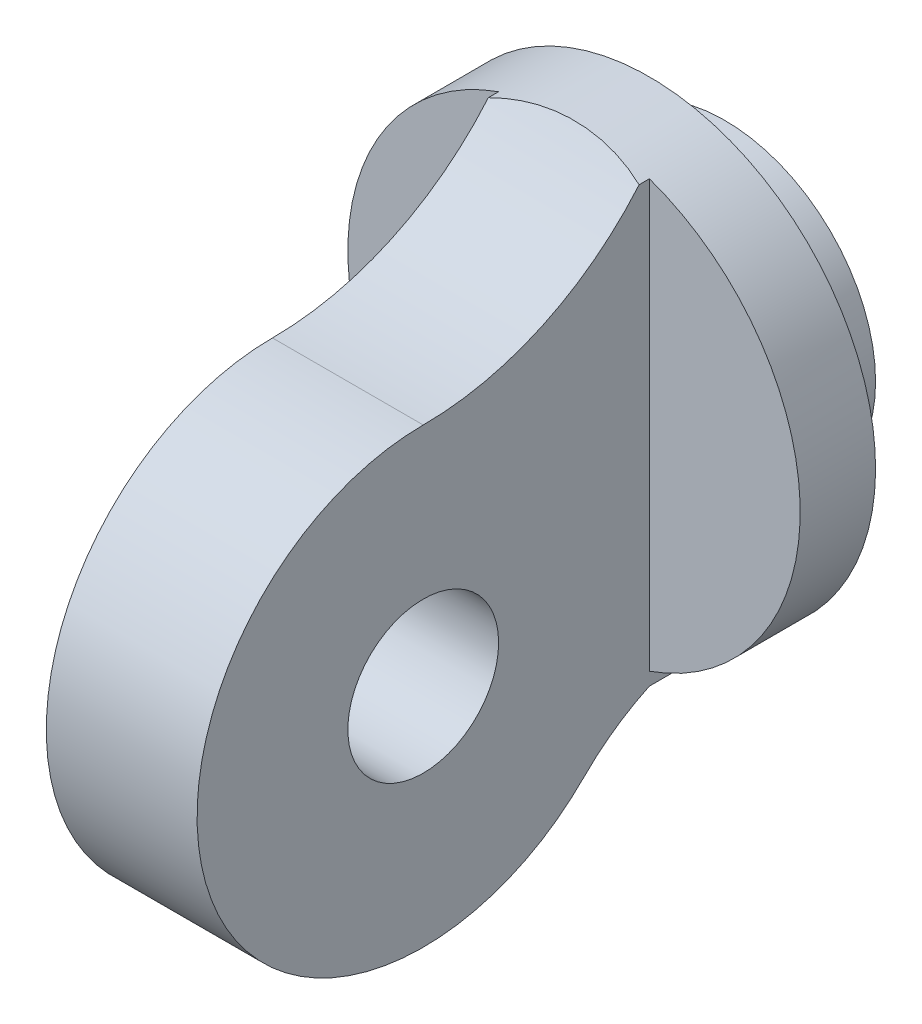
ISO-10303-21;
HEADER;
FILE_DESCRIPTION(('STEP AP214'),'2;1');
FILE_NAME('part.step','',(''),(''),'','','');
FILE_SCHEMA(('AUTOMOTIVE_DESIGN { 1 0 10303 214 1 1 1 1 }'));
ENDSEC;
DATA;
#1=APPLICATION_CONTEXT('core data for automotive mechanical design processes');
#2=APPLICATION_PROTOCOL_DEFINITION('international standard','automotive_design',2000,#1);
#3=PRODUCT_CONTEXT('',#1,'mechanical');
#4=PRODUCT('Part','Part','',(#3));
#5=PRODUCT_RELATED_PRODUCT_CATEGORY('part','',(#4));
#6=PRODUCT_DEFINITION_FORMATION('','',#4);
#7=PRODUCT_DEFINITION_CONTEXT('part definition',#1,'design');
#8=PRODUCT_DEFINITION('design','',#6,#7);
#9=PRODUCT_DEFINITION_SHAPE('','',#8);
#10=(LENGTH_UNIT() NAMED_UNIT(*) SI_UNIT(.MILLI.,.METRE.));
#11=(NAMED_UNIT(*) PLANE_ANGLE_UNIT() SI_UNIT($,.RADIAN.));
#12=(NAMED_UNIT(*) SI_UNIT($,.STERADIAN.) SOLID_ANGLE_UNIT());
#13=UNCERTAINTY_MEASURE_WITH_UNIT(LENGTH_MEASURE(1.E-05),#10,'distance_accuracy_value','');
#14=(GEOMETRIC_REPRESENTATION_CONTEXT(3) GLOBAL_UNCERTAINTY_ASSIGNED_CONTEXT((#13)) GLOBAL_UNIT_ASSIGNED_CONTEXT((#10,
#11,#12)) REPRESENTATION_CONTEXT('',''));
#15=CARTESIAN_POINT('',(0.,0.,0.));
#16=DIRECTION('',(0.,0.,1.));
#17=DIRECTION('',(1.,0.,0.));
#18=AXIS2_PLACEMENT_3D('',#15,#16,#17);
#19=CARTESIAN_POINT('',(0.,0.,500.));
#20=DIRECTION('',(0.,0.,-1.));
#21=DIRECTION('',(-1.,0.,0.));
#22=AXIS2_PLACEMENT_3D('',#19,#20,#21);
#23=CYLINDRICAL_SURFACE('',#22,750.);
#24=DIRECTION('',(0.,0.,1.));
#25=VECTOR('',#24,1.);
#26=CARTESIAN_POINT('',(250.,-707.106781186547,-3.65296808864413));
#27=LINE('',#26,#25);
#28=CARTESIAN_POINT('',(250.,-707.106781186548,250.));
#29=VERTEX_POINT('',#28);
#30=CARTESIAN_POINT('',(250.,-707.106781186547,500.));
#31=VERTEX_POINT('',#30);
#32=EDGE_CURVE('E113',#29,#31,#27,.T.);
#33=ORIENTED_EDGE('',*,*,#32,.F.);
#34=CARTESIAN_POINT('',(0.,0.,250.));
#35=DIRECTION('',(0.,0.,1.));
#36=DIRECTION('',(1.,0.,0.));
#37=AXIS2_PLACEMENT_3D('',#34,#35,#36);
#38=CIRCLE('',#37,750.);
#39=CARTESIAN_POINT('',(-250.,-707.106781186548,250.));
#40=VERTEX_POINT('',#39);
#41=EDGE_CURVE('E53',#29,#40,#38,.T.);
#42=ORIENTED_EDGE('',*,*,#41,.T.);
#43=DIRECTION('',(0.,0.,1.));
#44=VECTOR('',#43,1.);
#45=CARTESIAN_POINT('',(-250.,-707.106781186548,-3.65296808864424));
#46=LINE('',#45,#44);
#47=CARTESIAN_POINT('',(-250.,-707.106781186548,500.));
#48=VERTEX_POINT('',#47);
#49=EDGE_CURVE('E120',#40,#48,#46,.T.);
#50=ORIENTED_EDGE('',*,*,#49,.T.);
#51=CARTESIAN_POINT('',(0.,0.,500.));
#52=DIRECTION('',(0.,0.,1.));
#53=DIRECTION('',(1.,0.,0.));
#54=AXIS2_PLACEMENT_3D('',#51,#52,#53);
#55=CIRCLE('',#54,750.);
#56=CARTESIAN_POINT('',(-250.,707.106781186547,500.));
#57=VERTEX_POINT('',#56);
#58=EDGE_CURVE('E175',#57,#48,#55,.T.);
#59=ORIENTED_EDGE('',*,*,#58,.F.);
#60=DIRECTION('',(0.,0.,-1.));
#61=VECTOR('',#60,1.);
#62=CARTESIAN_POINT('',(-250.,707.106781186547,1000.));
#63=LINE('',#62,#61);
#64=CARTESIAN_POINT('',(-250.,707.106781186548,534.175090811526));
#65=VERTEX_POINT('',#64);
#66=EDGE_CURVE('E138',#65,#57,#63,.T.);
#67=ORIENTED_EDGE('',*,*,#66,.F.);
#68=CARTESIAN_POINT('',(250.,707.106781186548,534.175090811526));
#69=CARTESIAN_POINT('',(246.191941850239,708.453148345272,533.036441886669));
#70=CARTESIAN_POINT('',(242.365000644026,709.77155409902,531.927933241565));
#71=CARTESIAN_POINT('',(234.675146337842,712.351048972723,529.770649127521));
#72=CARTESIAN_POINT('',(230.812233336519,713.612138249805,528.721873494826));
#73=CARTESIAN_POINT('',(223.052244294361,716.075602463128,526.683511119058));
#74=CARTESIAN_POINT('',(219.155168566728,717.277977936991,525.693923833997));
#75=CARTESIAN_POINT('',(211.328724284269,719.622720787821,523.773398040683));
#76=CARTESIAN_POINT('',(207.399355710748,720.765088130048,522.842459566385));
#77=CARTESIAN_POINT('',(195.562200515599,724.10126910896,520.136041703542));
#78=CARTESIAN_POINT('',(187.608178490234,726.203267352907,518.447697611648));
#79=CARTESIAN_POINT('',(171.593009450379,730.153318989154,515.29940069821));
#80=CARTESIAN_POINT('',(163.53186341842,732.001374708824,513.839445783473));
#81=CARTESIAN_POINT('',(147.385376579382,735.4216981669,511.155246388456));
#82=CARTESIAN_POINT('',(139.300815353901,736.996163671508,509.929114991792));
#83=CARTESIAN_POINT('',(123.054848895613,739.882133764099,507.693889739893));
#84=CARTESIAN_POINT('',(114.893441119009,741.19362961492,506.684803095884));
#85=CARTESIAN_POINT('',(98.5131172140156,743.547977830001,504.881188219479));
#86=CARTESIAN_POINT('',(90.2942351963159,744.590977600765,504.086542245812));
#87=CARTESIAN_POINT('',(73.8097608681957,746.405292843432,502.708668934933));
#88=CARTESIAN_POINT('',(65.5441747647901,747.176643593207,502.125414144983));
#89=CARTESIAN_POINT('',(52.5076453382781,748.17490983038,501.372159494193));
#90=CARTESIAN_POINT('',(47.7475013563165,748.493788602235,501.131948268736));
#91=CARTESIAN_POINT('',(38.2198149908884,749.040725364522,500.720336115903));
#92=CARTESIAN_POINT('',(33.4522740902976,749.268799661843,500.548922833578));
#93=CARTESIAN_POINT('',(23.9057325977267,749.634152201581,500.274490443478));
#94=CARTESIAN_POINT('',(19.1267251348239,749.771315788681,500.171557701787));
#95=CARTESIAN_POINT('',(9.5651943960997,749.954250358413,500.034306919505));
#96=CARTESIAN_POINT('',(4.78267064413423,750.000004980527,500.000001161877));
#97=CARTESIAN_POINT('',(-8.35427772431913,749.999991300111,499.999997970456));
#98=CARTESIAN_POINT('',(-16.7090036524145,749.860358909788,500.104667615957));
#99=CARTESIAN_POINT('',(-33.404749583592,749.302277944424,500.523720093052));
#100=CARTESIAN_POINT('',(-41.7457676112026,748.88379220536,500.838130877787));
#101=CARTESIAN_POINT('',(-58.4034827552077,747.769182826168,501.677982313723));
#102=CARTESIAN_POINT('',(-66.7201631144552,747.072899561063,502.203544295534));
#103=CARTESIAN_POINT('',(-83.3092908516883,745.405295570343,503.467388364468));
#104=CARTESIAN_POINT('',(-91.5817401641561,744.433986975121,504.2056610697));
#105=CARTESIAN_POINT('',(-108.070268803233,742.219663112809,505.897501011021));
#106=CARTESIAN_POINT('',(-116.286332965753,740.976577497098,506.851123991954));
#107=CARTESIAN_POINT('',(-132.645618680387,738.223504793889,508.976531373502));
#108=CARTESIAN_POINT('',(-140.788836931215,736.713505673941,510.148325609397));
#109=CARTESIAN_POINT('',(-156.982505912842,733.433503098171,512.712693571711));
#110=CARTESIAN_POINT('',(-165.033008491727,731.663653412844,514.105136764155));
#111=CARTESIAN_POINT('',(-181.030661639483,727.870496999144,517.114977261092));
#112=CARTESIAN_POINT('',(-188.977826410748,725.847225515426,518.732343287868));
#113=CARTESIAN_POINT('',(-201.383131610196,722.472668469653,521.455913628077));
#114=CARTESIAN_POINT('',(-205.880891398384,721.203728662547,522.48517593714));
#115=CARTESIAN_POINT('',(-214.834597828772,718.587394079174,524.619467449687));
#116=CARTESIAN_POINT('',(-219.290551816604,717.240013397194,525.724483048089));
#117=CARTESIAN_POINT('',(-228.148809621048,714.47155600166,528.008694611554));
#118=CARTESIAN_POINT('',(-232.551210650104,713.050649697971,529.187720287223));
#119=CARTESIAN_POINT('',(-241.310561851852,710.134166327496,531.623180405175));
#120=CARTESIAN_POINT('',(-245.6675037123,708.638575884219,532.879628723934));
#121=CARTESIAN_POINT('',(-250.,707.106781186548,534.175090811526));
#122=B_SPLINE_CURVE_WITH_KNOTS('',3,(#68,#69,#70,#71,#72,#73,#74,#75,#76,#77,#78,#79,#80,#81,
#82,#83,#84,#85,#86,#87,#88,#89,#90,#91,#92,#93,#94,#95,#96,#97,#98,#99,#100,#101,#102,#103,
#104,#105,#106,#107,#108,#109,#110,#111,#112,#113,#114,#115,#116,#117,#118,#119,#120,#121),
.UNSPECIFIED.,.F.,.F.,(4,2,2,2,2,2,2,2,2,2,2,2,2,2,2,2,2,2,2,2,2,2,2,2,2,2,4),(0.,
12.5892029864666,25.1783714589317,37.7674246348874,50.3564850989266,75.54372912454,
100.730742294816,125.704995899522,150.680079135917,175.641421467247,200.599520981754,
214.928906730031,229.255718009929,243.600563854887,257.947976932624,283.009764037691,
308.074891906723,333.154443216535,358.232888528521,383.317833018494,408.40390862535,
433.475198558942,458.543005564548,472.897780151472,487.249983380303,501.570295134594,
515.893181028889),.UNSPECIFIED.);
#123=CARTESIAN_POINT('',(250.,707.106781186548,534.175090811526));
#124=VERTEX_POINT('',#123);
#125=EDGE_CURVE('E11',#124,#65,#122,.T.);
#126=ORIENTED_EDGE('',*,*,#125,.F.);
#127=DIRECTION('',(0.,0.,-1.));
#128=VECTOR('',#127,1.);
#129=CARTESIAN_POINT('',(250.,707.106781186548,1000.));
#130=LINE('',#129,#128);
#131=CARTESIAN_POINT('',(250.,707.106781186548,500.));
#132=VERTEX_POINT('',#131);
#133=EDGE_CURVE('E142',#124,#132,#130,.T.);
#134=ORIENTED_EDGE('',*,*,#133,.T.);
#135=EDGE_CURVE('E172',#31,#132,#55,.T.);
#136=ORIENTED_EDGE('',*,*,#135,.F.);
#137=EDGE_LOOP('',(#33,#42,#50,#59,#67,#126,#134,#136));
#138=FACE_BOUND('',#137,.T.);
#139=ADVANCED_FACE('F33',(#138),#23,.T.);
#140=CARTESIAN_POINT('',(0.,0.,500.));
#141=DIRECTION('',(0.,0.,1.));
#142=DIRECTION('',(1.,0.,0.));
#143=AXIS2_PLACEMENT_3D('',#140,#141,#142);
#144=PLANE('',#143);
#145=ORIENTED_EDGE('',*,*,#58,.T.);
#146=DIRECTION('',(0.,1.,0.));
#147=VECTOR('',#146,1.);
#148=CARTESIAN_POINT('',(-250.,750.,500.));
#149=LINE('',#148,#147);
#150=EDGE_CURVE('E46',#48,#57,#149,.T.);
#151=ORIENTED_EDGE('',*,*,#150,.T.);
#152=EDGE_LOOP('',(#145,#151));
#153=FACE_BOUND('',#152,.T.);
#154=ADVANCED_FACE('F200',(#153),#144,.T.);
#155=CARTESIAN_POINT('',(0.,0.,250.));
#156=DIRECTION('',(0.,0.,-1.));
#157=DIRECTION('',(-1.,0.,0.));
#158=AXIS2_PLACEMENT_3D('',#155,#156,#157);
#159=CYLINDRICAL_SURFACE('',#158,500.);
#160=CARTESIAN_POINT('',(0.,0.,250.));
#161=DIRECTION('',(0.,0.,1.));
#162=DIRECTION('',(1.,0.,0.));
#163=AXIS2_PLACEMENT_3D('',#160,#161,#162);
#164=CIRCLE('',#163,500.);
#165=CARTESIAN_POINT('',(500.,0.,250.));
#166=VERTEX_POINT('',#165);
#167=EDGE_CURVE('E160',#166,#166,#164,.T.);
#168=ORIENTED_EDGE('',*,*,#167,.F.);
#169=EDGE_LOOP('',(#168));
#170=FACE_BOUND('',#169,.T.);
#171=CARTESIAN_POINT('',(0.,0.,0.));
#172=DIRECTION('',(0.,0.,1.));
#173=DIRECTION('',(1.,0.,0.));
#174=AXIS2_PLACEMENT_3D('',#171,#172,#173);
#175=CIRCLE('',#174,500.);
#176=CARTESIAN_POINT('',(500.,0.,0.));
#177=VERTEX_POINT('',#176);
#178=EDGE_CURVE('E180',#177,#177,#175,.T.);
#179=ORIENTED_EDGE('',*,*,#178,.T.);
#180=EDGE_LOOP('',(#179));
#181=FACE_BOUND('',#180,.T.);
#182=ADVANCED_FACE('F35',(#170,#181),#159,.T.);
#183=CARTESIAN_POINT('',(0.,0.,0.));
#184=DIRECTION('',(0.,0.,1.));
#185=DIRECTION('',(1.,0.,0.));
#186=AXIS2_PLACEMENT_3D('',#183,#184,#185);
#187=PLANE('',#186);
#188=CARTESIAN_POINT('',(0.,0.,0.));
#189=DIRECTION('',(0.,0.,-1.));
#190=DIRECTION('',(-1.,0.,0.));
#191=AXIS2_PLACEMENT_3D('',#188,#189,#190);
#192=CIRCLE('',#191,125.);
#193=CARTESIAN_POINT('',(-125.,0.,0.));
#194=VERTEX_POINT('',#193);
#195=EDGE_CURVE('E181',#194,#194,#192,.T.);
#196=ORIENTED_EDGE('',*,*,#195,.F.);
#197=EDGE_LOOP('',(#196));
#198=FACE_BOUND('',#197,.T.);
#199=ORIENTED_EDGE('',*,*,#178,.F.);
#200=EDGE_LOOP('',(#199));
#201=FACE_BOUND('',#200,.T.);
#202=ADVANCED_FACE('F189',(#198,#201),#187,.F.);
#203=CARTESIAN_POINT('',(0.,0.,100.));
#204=DIRECTION('',(0.,0.,-1.));
#205=DIRECTION('',(-1.,0.,0.));
#206=AXIS2_PLACEMENT_3D('',#203,#204,#205);
#207=CYLINDRICAL_SURFACE('',#206,125.);
#208=CARTESIAN_POINT('',(0.,0.,100.));
#209=DIRECTION('',(0.,0.,-1.));
#210=DIRECTION('',(-1.,0.,0.));
#211=AXIS2_PLACEMENT_3D('',#208,#209,#210);
#212=CIRCLE('',#211,125.);
#213=CARTESIAN_POINT('',(-125.,0.,100.));
#214=VERTEX_POINT('',#213);
#215=EDGE_CURVE('E177',#214,#214,#212,.T.);
#216=ORIENTED_EDGE('',*,*,#215,.F.);
#217=EDGE_LOOP('',(#216));
#218=FACE_BOUND('',#217,.T.);
#219=ORIENTED_EDGE('',*,*,#195,.T.);
#220=EDGE_LOOP('',(#219));
#221=FACE_BOUND('',#220,.T.);
#222=ADVANCED_FACE('F191',(#218,#221),#207,.F.);
#223=CARTESIAN_POINT('',(0.,0.,100.));
#224=DIRECTION('',(0.,0.,-1.));
#225=DIRECTION('',(-1.,0.,0.));
#226=AXIS2_PLACEMENT_3D('',#223,#224,#225);
#227=PLANE('',#226);
#228=ORIENTED_EDGE('',*,*,#215,.T.);
#229=EDGE_LOOP('',(#228));
#230=FACE_BOUND('',#229,.T.);
#231=ADVANCED_FACE('F197',(#230),#227,.T.);
#232=CARTESIAN_POINT('',(0.,0.,250.));
#233=DIRECTION('',(0.,0.,1.));
#234=DIRECTION('',(1.,0.,0.));
#235=AXIS2_PLACEMENT_3D('',#232,#233,#234);
#236=PLANE('',#235);
#237=ORIENTED_EDGE('',*,*,#41,.F.);
#238=DIRECTION('',(0.,1.,0.));
#239=VECTOR('',#238,1.);
#240=CARTESIAN_POINT('',(250.,-707.106781186547,250.));
#241=LINE('',#240,#239);
#242=CARTESIAN_POINT('',(250.,-750.,250.));
#243=VERTEX_POINT('',#242);
#244=EDGE_CURVE('E107',#243,#29,#241,.T.);
#245=ORIENTED_EDGE('',*,*,#244,.F.);
#246=CARTESIAN_POINT('',(0.,0.,250.));
#247=DIRECTION('',(0.,0.,-1.));
#248=DIRECTION('',(-1.,0.,0.));
#249=AXIS2_PLACEMENT_3D('',#246,#247,#248);
#250=CIRCLE('',#249,790.569415042095);
#251=CARTESIAN_POINT('',(-250.,-750.,250.));
#252=VERTEX_POINT('',#251);
#253=EDGE_CURVE('E119',#243,#252,#250,.T.);
#254=ORIENTED_EDGE('',*,*,#253,.T.);
#255=DIRECTION('',(0.,-1.,0.));
#256=VECTOR('',#255,1.);
#257=CARTESIAN_POINT('',(-250.,-750.,250.));
#258=LINE('',#257,#256);
#259=EDGE_CURVE('E136',#40,#252,#258,.T.);
#260=ORIENTED_EDGE('',*,*,#259,.F.);
#261=EDGE_LOOP('',(#237,#245,#254,#260));
#262=FACE_BOUND('',#261,.T.);
#263=ORIENTED_EDGE('',*,*,#167,.T.);
#264=EDGE_LOOP('',(#263));
#265=FACE_BOUND('',#264,.T.);
#266=ADVANCED_FACE('F117',(#262,#265),#236,.F.);
#267=DIRECTION('',(0.,1.,0.));
#268=VECTOR('',#267,1.);
#269=CARTESIAN_POINT('',(250.,750.,500.));
#270=LINE('',#269,#268);
#271=EDGE_CURVE('E158',#31,#132,#270,.T.);
#272=ORIENTED_EDGE('',*,*,#271,.F.);
#273=ORIENTED_EDGE('',*,*,#135,.T.);
#274=EDGE_LOOP('',(#272,#273));
#275=FACE_BOUND('',#274,.T.);
#276=ADVANCED_FACE('F210',(#275),#144,.T.);
#277=CARTESIAN_POINT('',(250.,1312.5,1250.));
#278=DIRECTION('',(-1.,0.,0.));
#279=DIRECTION('',(0.,0.,1.));
#280=AXIS2_PLACEMENT_3D('',#277,#278,#279);
#281=PLANE('',#280);
#282=ORIENTED_EDGE('',*,*,#271,.T.);
#283=ORIENTED_EDGE('',*,*,#133,.F.);
#284=CARTESIAN_POINT('',(250.,1312.5,1250.));
#285=DIRECTION('',(-1.,0.,0.));
#286=DIRECTION('',(0.,0.,1.));
#287=AXIS2_PLACEMENT_3D('',#284,#285,#286);
#288=CIRCLE('',#287,937.499999999999);
#289=CARTESIAN_POINT('',(250.,374.999999999999,1250.));
#290=VERTEX_POINT('',#289);
#291=EDGE_CURVE('E151',#124,#290,#288,.T.);
#292=ORIENTED_EDGE('',*,*,#291,.T.);
#293=CARTESIAN_POINT('',(250.,-375.,1250.));
#294=DIRECTION('',(1.,0.,0.));
#295=DIRECTION('',(0.,0.,-1.));
#296=AXIS2_PLACEMENT_3D('',#293,#294,#295);
#297=CIRCLE('',#296,750.);
#298=CARTESIAN_POINT('',(250.,-902.541163606126,716.895581803063));
#299=VERTEX_POINT('',#298);
#300=EDGE_CURVE('E153',#290,#299,#297,.T.);
#301=ORIENTED_EDGE('',*,*,#300,.T.);
#302=CARTESIAN_POINT('',(250.,-1430.08232721225,183.791163606125));
#303=DIRECTION('',(-1.,0.,0.));
#304=DIRECTION('',(0.,0.,-1.));
#305=AXIS2_PLACEMENT_3D('',#302,#303,#304);
#306=CIRCLE('',#305,750.);
#307=CARTESIAN_POINT('',(250.,-750.,500.));
#308=VERTEX_POINT('',#307);
#309=EDGE_CURVE('E109',#299,#308,#306,.T.);
#310=ORIENTED_EDGE('',*,*,#309,.T.);
#311=DIRECTION('',(0.,0.,1.));
#312=VECTOR('',#311,1.);
#313=CARTESIAN_POINT('',(250.,-750.,-3.65296808864413));
#314=LINE('',#313,#312);
#315=EDGE_CURVE('E102',#243,#308,#314,.T.);
#316=ORIENTED_EDGE('',*,*,#315,.F.);
#317=ORIENTED_EDGE('',*,*,#244,.T.);
#318=ORIENTED_EDGE('',*,*,#32,.T.);
#319=EDGE_LOOP('',(#282,#283,#292,#301,#310,#316,#317,#318));
#320=FACE_BOUND('',#319,.T.);
#321=CARTESIAN_POINT('',(250.,-375.,1250.));
#322=DIRECTION('',(1.,0.,0.));
#323=DIRECTION('',(0.,0.,-1.));
#324=AXIS2_PLACEMENT_3D('',#321,#322,#323);
#325=CIRCLE('',#324,250.);
#326=CARTESIAN_POINT('',(250.,-375.,1000.));
#327=VERTEX_POINT('',#326);
#328=EDGE_CURVE('E145',#327,#327,#325,.T.);
#329=ORIENTED_EDGE('',*,*,#328,.F.);
#330=EDGE_LOOP('',(#329));
#331=FACE_BOUND('',#330,.T.);
#332=ADVANCED_FACE('F105',(#320,#331),#281,.F.);
#333=CARTESIAN_POINT('',(-250.,1312.5,1250.));
#334=DIRECTION('',(-1.,0.,0.));
#335=DIRECTION('',(0.,0.,1.));
#336=AXIS2_PLACEMENT_3D('',#333,#334,#335);
#337=PLANE('',#336);
#338=ORIENTED_EDGE('',*,*,#66,.T.);
#339=ORIENTED_EDGE('',*,*,#150,.F.);
#340=ORIENTED_EDGE('',*,*,#49,.F.);
#341=ORIENTED_EDGE('',*,*,#259,.T.);
#342=DIRECTION('',(0.,0.,1.));
#343=VECTOR('',#342,1.);
#344=CARTESIAN_POINT('',(-250.,-750.,-3.65296808864424));
#345=LINE('',#344,#343);
#346=CARTESIAN_POINT('',(-250.,-750.,500.));
#347=VERTEX_POINT('',#346);
#348=EDGE_CURVE('E125',#252,#347,#345,.T.);
#349=ORIENTED_EDGE('',*,*,#348,.T.);
#350=CARTESIAN_POINT('',(-250.,-1430.08232721225,183.791163606125));
#351=DIRECTION('',(-1.,0.,0.));
#352=DIRECTION('',(0.,0.,-1.));
#353=AXIS2_PLACEMENT_3D('',#350,#351,#352);
#354=CIRCLE('',#353,750.);
#355=CARTESIAN_POINT('',(-250.,-902.541163606126,716.895581803063));
#356=VERTEX_POINT('',#355);
#357=EDGE_CURVE('E154',#356,#347,#354,.T.);
#358=ORIENTED_EDGE('',*,*,#357,.F.);
#359=CARTESIAN_POINT('',(-250.,-375.,1250.));
#360=DIRECTION('',(1.,0.,0.));
#361=DIRECTION('',(0.,0.,-1.));
#362=AXIS2_PLACEMENT_3D('',#359,#360,#361);
#363=CIRCLE('',#362,750.);
#364=CARTESIAN_POINT('',(-250.,374.999999999999,1250.));
#365=VERTEX_POINT('',#364);
#366=EDGE_CURVE('E162',#365,#356,#363,.T.);
#367=ORIENTED_EDGE('',*,*,#366,.F.);
#368=CARTESIAN_POINT('',(-250.,1312.5,1250.));
#369=DIRECTION('',(-1.,0.,0.));
#370=DIRECTION('',(0.,0.,1.));
#371=AXIS2_PLACEMENT_3D('',#368,#369,#370);
#372=CIRCLE('',#371,937.499999999999);
#373=EDGE_CURVE('E148',#65,#365,#372,.T.);
#374=ORIENTED_EDGE('',*,*,#373,.F.);
#375=EDGE_LOOP('',(#338,#339,#340,#341,#349,#358,#367,#374));
#376=FACE_BOUND('',#375,.T.);
#377=CARTESIAN_POINT('',(-250.,-375.,1250.));
#378=DIRECTION('',(1.,0.,0.));
#379=DIRECTION('',(0.,0.,-1.));
#380=AXIS2_PLACEMENT_3D('',#377,#378,#379);
#381=CIRCLE('',#380,250.);
#382=CARTESIAN_POINT('',(-250.,-375.,1000.));
#383=VERTEX_POINT('',#382);
#384=EDGE_CURVE('E144',#383,#383,#381,.T.);
#385=ORIENTED_EDGE('',*,*,#384,.T.);
#386=EDGE_LOOP('',(#385));
#387=FACE_BOUND('',#386,.T.);
#388=ADVANCED_FACE('F227',(#376,#387),#337,.T.);
#389=CARTESIAN_POINT('',(250.,1312.5,1250.));
#390=DIRECTION('',(-1.,0.,0.));
#391=DIRECTION('',(0.,0.,1.));
#392=AXIS2_PLACEMENT_3D('',#389,#390,#391);
#393=CYLINDRICAL_SURFACE('',#392,937.499999999999);
#394=ORIENTED_EDGE('',*,*,#125,.T.);
#395=ORIENTED_EDGE('',*,*,#373,.T.);
#396=DIRECTION('',(-1.,0.,0.));
#397=VECTOR('',#396,1.);
#398=CARTESIAN_POINT('',(250.,374.999999999999,1250.));
#399=LINE('',#398,#397);
#400=EDGE_CURVE('E169',#290,#365,#399,.T.);
#401=ORIENTED_EDGE('',*,*,#400,.F.);
#402=ORIENTED_EDGE('',*,*,#291,.F.);
#403=EDGE_LOOP('',(#394,#395,#401,#402));
#404=FACE_BOUND('',#403,.T.);
#405=ADVANCED_FACE('F230',(#404),#393,.F.);
#406=CARTESIAN_POINT('',(250.,-375.,1250.));
#407=DIRECTION('',(-1.,0.,0.));
#408=DIRECTION('',(0.,0.,1.));
#409=AXIS2_PLACEMENT_3D('',#406,#407,#408);
#410=CYLINDRICAL_SURFACE('',#409,750.);
#411=ORIENTED_EDGE('',*,*,#366,.T.);
#412=DIRECTION('',(-1.,0.,0.));
#413=VECTOR('',#412,1.);
#414=CARTESIAN_POINT('',(250.,-902.541163606126,716.895581803063));
#415=LINE('',#414,#413);
#416=EDGE_CURVE('E157',#299,#356,#415,.T.);
#417=ORIENTED_EDGE('',*,*,#416,.F.);
#418=ORIENTED_EDGE('',*,*,#300,.F.);
#419=ORIENTED_EDGE('',*,*,#400,.T.);
#420=EDGE_LOOP('',(#411,#417,#418,#419));
#421=FACE_BOUND('',#420,.T.);
#422=ADVANCED_FACE('F234',(#421),#410,.T.);
#423=CARTESIAN_POINT('',(250.,-1430.08232721225,183.791163606125));
#424=DIRECTION('',(-1.,0.,0.));
#425=DIRECTION('',(0.,0.,1.));
#426=AXIS2_PLACEMENT_3D('',#423,#424,#425);
#427=CYLINDRICAL_SURFACE('',#426,750.);
#428=ORIENTED_EDGE('',*,*,#357,.T.);
#429=CARTESIAN_POINT('',(250.,-750.,500.00000000002));
#430=CARTESIAN_POINT('',(247.768675617477,-750.743777941512,501.599667631304));
#431=CARTESIAN_POINT('',(245.518143995415,-751.482886966434,503.17453832753));
#432=CARTESIAN_POINT('',(240.979641077429,-752.950529678924,506.274450201409));
#433=CARTESIAN_POINT('',(238.691669947584,-753.679063413377,507.79949160001));
#434=CARTESIAN_POINT('',(231.773485141133,-755.84681252534,512.299243002088));
#435=CARTESIAN_POINT('',(227.088558864647,-757.26832323317,515.198896317643));
#436=CARTESIAN_POINT('',(217.584490457932,-760.05361993089,520.794571447229));
#437=CARTESIAN_POINT('',(212.765394526337,-761.417425392631,523.490662195504));
#438=CARTESIAN_POINT('',(203.000786269057,-764.078717803693,528.67910657293));
#439=CARTESIAN_POINT('',(198.055273018163,-765.376204267436,531.171458710421));
#440=CARTESIAN_POINT('',(188.058306127877,-767.893603730237,535.94647628447));
#441=CARTESIAN_POINT('',(183.007099331259,-769.113675366131,538.229575089778));
#442=CARTESIAN_POINT('',(172.798470164754,-771.471407229315,542.591669745062));
#443=CARTESIAN_POINT('',(167.641047945895,-772.609067573775,544.670665885225));
#444=CARTESIAN_POINT('',(157.229638120047,-774.794899506293,548.624674689077));
#445=CARTESIAN_POINT('',(151.975645289787,-775.843066236444,550.499676281016));
#446=CARTESIAN_POINT('',(141.381335999639,-777.843414855786,554.04586752104));
#447=CARTESIAN_POINT('',(136.041019520257,-778.7955967233,555.717057123098));
#448=CARTESIAN_POINT('',(125.288853055468,-780.597457552374,558.854723996237));
#449=CARTESIAN_POINT('',(119.877071391749,-781.447227518005,560.321383199604));
#450=CARTESIAN_POINT('',(108.987211992575,-783.04027316424,563.052392277556));
#451=CARTESIAN_POINT('',(103.509134265768,-783.783548858737,564.316742178531));
#452=CARTESIAN_POINT('',(92.4965895859063,-785.159329711896,566.64381734191));
#453=CARTESIAN_POINT('',(86.9621230078952,-785.791835606784,567.706543944393));
#454=CARTESIAN_POINT('',(75.8465773257798,-786.942511667307,569.631071804806));
#455=CARTESIAN_POINT('',(70.2654982049686,-787.46068179196,570.492872990717));
#456=CARTESIAN_POINT('',(59.0643222836583,-788.379981960926,572.01647464703));
#457=CARTESIAN_POINT('',(53.4442112443734,-788.78106671835,572.678197733711));
#458=CARTESIAN_POINT('',(42.1768249999084,-789.463723365739,573.801723138616));
#459=CARTESIAN_POINT('',(36.5295498108508,-789.745295326629,574.263525575481));
#460=CARTESIAN_POINT('',(25.2174815750161,-790.187394415258,574.987604011646));
#461=CARTESIAN_POINT('',(19.5526884693494,-790.347921135636,575.249879339465));
#462=CARTESIAN_POINT('',(8.21523625588567,-790.547060308879,575.575132992588));
#463=CARTESIAN_POINT('',(2.54257712721306,-790.585672437574,575.638110787962));
#464=CARTESIAN_POINT('',(-8.88771471813334,-790.540428395014,575.564263664682));
#465=CARTESIAN_POINT('',(-14.6453204902858,-790.454690638145,575.424369009296));
#466=CARTESIAN_POINT('',(-26.1486404917815,-790.157802273194,574.939068071473));
#467=CARTESIAN_POINT('',(-31.8943546847576,-789.946651282137,574.593661161463));
#468=CARTESIAN_POINT('',(-43.3639399655616,-789.400108959688,573.697012325058));
#469=CARTESIAN_POINT('',(-49.0878104430776,-789.064714182239,573.145764689411));
#470=CARTESIAN_POINT('',(-60.5033961911913,-788.271574447565,571.836963804256));
#471=CARTESIAN_POINT('',(-66.19511152223,-787.813829720395,571.079410942665));
#472=CARTESIAN_POINT('',(-77.5340542101657,-786.77879280855,569.357722043719));
#473=CARTESIAN_POINT('',(-83.1812976314625,-786.201546060852,568.393664518607));
#474=CARTESIAN_POINT('',(-94.4232674053022,-784.930726689632,566.258098270247));
#475=CARTESIAN_POINT('',(-100.017993551517,-784.237153609295,565.086588732328));
#476=CARTESIAN_POINT('',(-111.144319078217,-782.737791220703,562.53545783604));
#477=CARTESIAN_POINT('',(-116.675921589082,-781.932007503511,561.155846846352));
#478=CARTESIAN_POINT('',(-127.665883016239,-780.213018581536,558.187775223194));
#479=CARTESIAN_POINT('',(-133.124243024401,-779.29981498011,556.599317706945));
#480=CARTESIAN_POINT('',(-143.55608993921,-777.442989414895,553.338383928664));
#481=CARTESIAN_POINT('',(-148.535545904986,-776.506630163142,551.680844743831));
#482=CARTESIAN_POINT('',(-158.414492055299,-774.551613165008,548.185856483349));
#483=CARTESIAN_POINT('',(-163.313983298996,-773.532956509751,546.348409792898));
#484=CARTESIAN_POINT('',(-173.024281394591,-771.41900769597,542.49363450302));
#485=CARTESIAN_POINT('',(-177.835097359215,-770.32372346819,540.47632451304));
#486=CARTESIAN_POINT('',(-187.360381207229,-768.06252921175,536.261737838951));
#487=CARTESIAN_POINT('',(-192.074848643626,-766.896618855531,534.064460320147));
#488=CARTESIAN_POINT('',(-201.405687692639,-764.499171777167,529.48719569081));
#489=CARTESIAN_POINT('',(-206.021915847929,-763.267547212915,527.106962046127));
#490=CARTESIAN_POINT('',(-215.141466332179,-760.747349535355,522.167249423251));
#491=CARTESIAN_POINT('',(-219.644789489248,-759.458776839928,519.607771760256));
#492=CARTESIAN_POINT('',(-228.532368925112,-756.831839986769,514.30973467551));
#493=CARTESIAN_POINT('',(-232.916584260045,-755.493459072715,511.571114748181));
#494=CARTESIAN_POINT('',(-239.396371957789,-753.455046473337,507.330932962822));
#495=CARTESIAN_POINT('',(-241.540302009979,-752.770405324806,505.895432536065));
#496=CARTESIAN_POINT('',(-245.795127854838,-751.391879403301,502.980566388111));
#497=CARTESIAN_POINT('',(-247.906023527295,-750.697994596706,501.501200507344));
#498=CARTESIAN_POINT('',(-249.999999999995,-750.000000000002,500.000000000004));
#499=B_SPLINE_CURVE_WITH_KNOTS('',3,(#429,#430,#431,#432,#433,#434,#435,#436,#437,#438,#439,
#440,#441,#442,#443,#444,#445,#446,#447,#448,#449,#450,#451,#452,#453,#454,#455,#456,#457,#458,
#459,#460,#461,#462,#463,#464,#465,#466,#467,#468,#469,#470,#471,#472,#473,#474,#475,#476,#477,
#478,#479,#480,#481,#482,#483,#484,#485,#486,#487,#488,#489,#490,#491,#492,#493,#494,#495,#496,
#497,#498),.UNSPECIFIED.,.F.,.F.,(4,2,2,2,2,2,2,2,2,2,2,2,2,2,2,2,2,2,2,2,2,2,2,2,2,2,2,2,2,2,2,
2,2,2,4),(0.,8.53300658943052,17.0659753375028,34.1302271270371,51.1886741320172,
68.2472460183243,85.2696507704932,102.292031320356,119.315335295081,136.338643114114,
153.346710564883,170.354775796901,187.362727981582,204.370686262573,221.385214280529,
238.399732201265,255.414307381671,272.428927803521,289.703704304256,306.97853355731,
324.253841985111,341.529117930257,358.797837505756,376.066624897471,393.334552153733,
410.602221700157,426.590931680684,442.579429712951,458.566275420321,474.553195279235,
490.562048532519,506.570784333509,522.584955310469,530.592728915653,538.60053165448),.UNSPECIFIED.);
#500=EDGE_CURVE('E126',#308,#347,#499,.T.);
#501=ORIENTED_EDGE('',*,*,#500,.F.);
#502=ORIENTED_EDGE('',*,*,#309,.F.);
#503=ORIENTED_EDGE('',*,*,#416,.T.);
#504=EDGE_LOOP('',(#428,#501,#502,#503));
#505=FACE_BOUND('',#504,.T.);
#506=ADVANCED_FACE('F237',(#505),#427,.F.);
#507=CARTESIAN_POINT('',(250.,-375.,1250.));
#508=DIRECTION('',(-1.,0.,0.));
#509=DIRECTION('',(0.,0.,1.));
#510=AXIS2_PLACEMENT_3D('',#507,#508,#509);
#511=CYLINDRICAL_SURFACE('',#510,250.);
#512=ORIENTED_EDGE('',*,*,#328,.T.);
#513=EDGE_LOOP('',(#512));
#514=FACE_BOUND('',#513,.T.);
#515=ORIENTED_EDGE('',*,*,#384,.F.);
#516=EDGE_LOOP('',(#515));
#517=FACE_BOUND('',#516,.T.);
#518=ADVANCED_FACE('F241',(#514,#517),#511,.F.);
#519=CARTESIAN_POINT('',(0.,0.,500000.));
#520=DIRECTION('',(0.,0.,-1.));
#521=DIRECTION('',(-1.,0.,0.));
#522=AXIS2_PLACEMENT_3D('',#519,#520,#521);
#523=CYLINDRICAL_SURFACE('',#522,790.569415042095);
#524=ORIENTED_EDGE('',*,*,#315,.T.);
#525=ORIENTED_EDGE('',*,*,#500,.T.);
#526=ORIENTED_EDGE('',*,*,#348,.F.);
#527=ORIENTED_EDGE('',*,*,#253,.F.);
#528=EDGE_LOOP('',(#524,#525,#526,#527));
#529=FACE_BOUND('',#528,.T.);
#530=ADVANCED_FACE('F123',(#529),#523,.T.);
#531=CLOSED_SHELL('',(#139,#154,#182,#202,#222,#231,#266,#276,#332,#388,#405,#422,#506,#518,#530));
#532=MANIFOLD_SOLID_BREP('B2',#531);
#533=ADVANCED_BREP_SHAPE_REPRESENTATION('',(#18,#532),#14);
#534=SHAPE_DEFINITION_REPRESENTATION(#9,#533);
ENDSEC;
END-ISO-10303-21;
